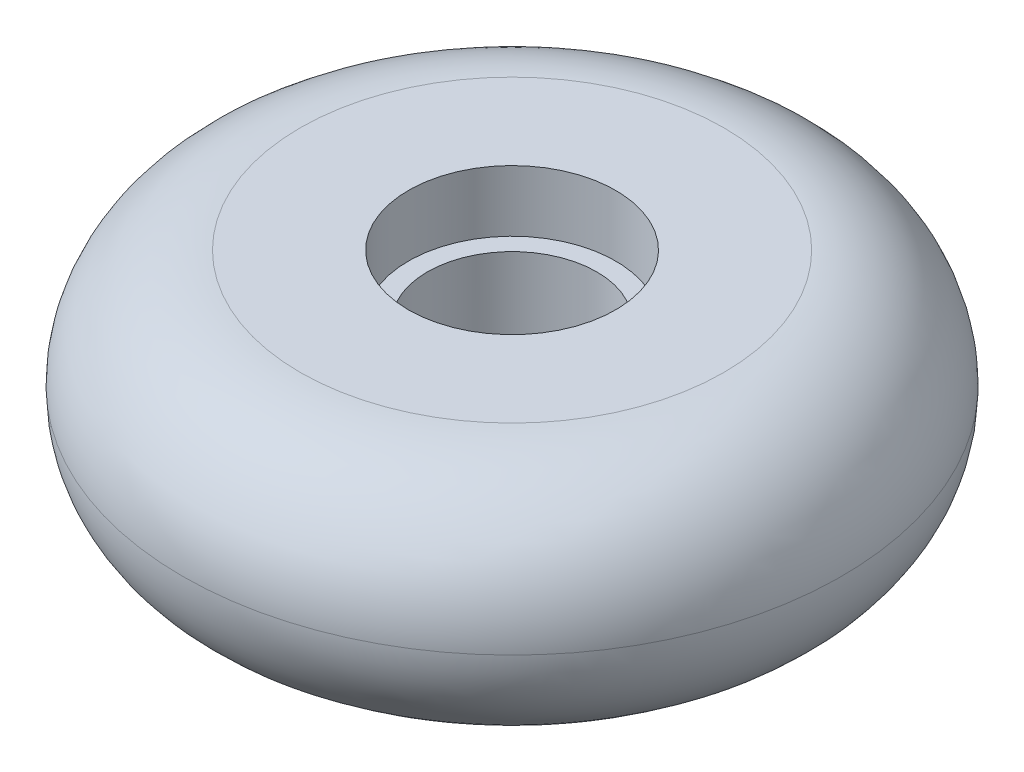
ISO-10303-21;
HEADER;
FILE_DESCRIPTION(('STEP AP214'),'2;1');
FILE_NAME('part.step','',(''),(''),'','','');
FILE_SCHEMA(('AUTOMOTIVE_DESIGN { 1 0 10303 214 1 1 1 1 }'));
ENDSEC;
DATA;
#1=APPLICATION_CONTEXT('core data for automotive mechanical design processes');
#2=APPLICATION_PROTOCOL_DEFINITION('international standard','automotive_design',2000,#1);
#3=PRODUCT_CONTEXT('',#1,'mechanical');
#4=PRODUCT('Part','Part','',(#3));
#5=PRODUCT_RELATED_PRODUCT_CATEGORY('part','',(#4));
#6=PRODUCT_DEFINITION_FORMATION('','',#4);
#7=PRODUCT_DEFINITION_CONTEXT('part definition',#1,'design');
#8=PRODUCT_DEFINITION('design','',#6,#7);
#9=PRODUCT_DEFINITION_SHAPE('','',#8);
#10=(LENGTH_UNIT() NAMED_UNIT(*) SI_UNIT(.MILLI.,.METRE.));
#11=(NAMED_UNIT(*) PLANE_ANGLE_UNIT() SI_UNIT($,.RADIAN.));
#12=(NAMED_UNIT(*) SI_UNIT($,.STERADIAN.) SOLID_ANGLE_UNIT());
#13=UNCERTAINTY_MEASURE_WITH_UNIT(LENGTH_MEASURE(1.E-05),#10,'distance_accuracy_value','');
#14=(GEOMETRIC_REPRESENTATION_CONTEXT(3) GLOBAL_UNCERTAINTY_ASSIGNED_CONTEXT((#13)) GLOBAL_UNIT_ASSIGNED_CONTEXT((#10,
#11,#12)) REPRESENTATION_CONTEXT('',''));
#15=CARTESIAN_POINT('',(0.,0.,0.));
#16=DIRECTION('',(0.,0.,1.));
#17=DIRECTION('',(1.,0.,0.));
#18=AXIS2_PLACEMENT_3D('',#15,#16,#17);
#19=CARTESIAN_POINT('',(0.,25.,0.));
#20=DIRECTION('',(0.,1.,0.));
#21=DIRECTION('',(0.,0.,1.));
#22=AXIS2_PLACEMENT_3D('',#19,#20,#21);
#23=PLANE('',#22);
#24=CARTESIAN_POINT('',(0.,25.,0.));
#25=DIRECTION('',(0.,1.,0.));
#26=DIRECTION('',(0.,0.,1.));
#27=AXIS2_PLACEMENT_3D('',#24,#25,#26);
#28=CIRCLE('',#27,11.);
#29=CARTESIAN_POINT('',(0.,25.,11.));
#30=VERTEX_POINT('',#29);
#31=EDGE_CURVE('E45',#30,#30,#28,.T.);
#32=ORIENTED_EDGE('',*,*,#31,.F.);
#33=EDGE_LOOP('',(#32));
#34=FACE_BOUND('',#33,.T.);
#35=CARTESIAN_POINT('',(0.,25.,0.));
#36=DIRECTION('',(0.,1.,0.));
#37=DIRECTION('',(0.,0.,1.));
#38=AXIS2_PLACEMENT_3D('',#35,#36,#37);
#39=CIRCLE('',#38,22.5);
#40=CARTESIAN_POINT('',(0.,25.,22.5));
#41=VERTEX_POINT('',#40);
#42=EDGE_CURVE('E10',#41,#41,#39,.T.);
#43=ORIENTED_EDGE('',*,*,#42,.T.);
#44=EDGE_LOOP('',(#43));
#45=FACE_BOUND('',#44,.T.);
#46=ADVANCED_FACE('F31',(#34,#45),#23,.T.);
#47=CARTESIAN_POINT('',(0.,0.,0.));
#48=DIRECTION('',(0.,1.,0.));
#49=DIRECTION('',(0.,0.,1.));
#50=AXIS2_PLACEMENT_3D('',#47,#48,#49);
#51=PLANE('',#50);
#52=CARTESIAN_POINT('',(0.,0.,0.));
#53=DIRECTION('',(0.,-1.,0.));
#54=DIRECTION('',(0.,0.,-1.));
#55=AXIS2_PLACEMENT_3D('',#52,#53,#54);
#56=CIRCLE('',#55,11.);
#57=CARTESIAN_POINT('',(0.,0.,-11.));
#58=VERTEX_POINT('',#57);
#59=EDGE_CURVE('E52',#58,#58,#56,.T.);
#60=ORIENTED_EDGE('',*,*,#59,.F.);
#61=EDGE_LOOP('',(#60));
#62=FACE_BOUND('',#61,.T.);
#63=CARTESIAN_POINT('',(0.,0.,0.));
#64=DIRECTION('',(0.,1.,0.));
#65=DIRECTION('',(0.,0.,1.));
#66=AXIS2_PLACEMENT_3D('',#63,#64,#65);
#67=CIRCLE('',#66,22.5);
#68=CARTESIAN_POINT('',(0.,0.,22.5));
#69=VERTEX_POINT('',#68);
#70=EDGE_CURVE('E39',#69,#69,#67,.F.);
#71=ORIENTED_EDGE('',*,*,#70,.T.);
#72=EDGE_LOOP('',(#71));
#73=FACE_BOUND('',#72,.T.);
#74=ADVANCED_FACE('F79',(#62,#73),#51,.F.);
#75=CARTESIAN_POINT('',(0.,12.5,0.));
#76=DIRECTION('',(0.,1.,0.));
#77=DIRECTION('',(0.,0.,1.));
#78=AXIS2_PLACEMENT_3D('',#75,#76,#77);
#79=TOROIDAL_SURFACE('',#78,22.5,12.5);
#80=ORIENTED_EDGE('',*,*,#42,.F.);
#81=EDGE_LOOP('',(#80));
#82=FACE_BOUND('',#81,.T.);
#83=CARTESIAN_POINT('',(0.,12.5,0.));
#84=DIRECTION('',(0.,1.,0.));
#85=DIRECTION('',(0.,0.,1.));
#86=AXIS2_PLACEMENT_3D('',#83,#84,#85);
#87=CIRCLE('',#86,35.);
#88=CARTESIAN_POINT('',(0.,12.5,35.));
#89=VERTEX_POINT('',#88);
#90=EDGE_CURVE('E35',#89,#89,#87,.F.);
#91=ORIENTED_EDGE('',*,*,#90,.F.);
#92=EDGE_LOOP('',(#91));
#93=FACE_BOUND('',#92,.T.);
#94=ADVANCED_FACE('F33',(#82,#93),#79,.T.);
#95=CARTESIAN_POINT('',(0.,12.5,0.));
#96=DIRECTION('',(0.,1.,0.));
#97=DIRECTION('',(0.,0.,1.));
#98=AXIS2_PLACEMENT_3D('',#95,#96,#97);
#99=TOROIDAL_SURFACE('',#98,22.5,12.5);
#100=ORIENTED_EDGE('',*,*,#70,.F.);
#101=EDGE_LOOP('',(#100));
#102=FACE_BOUND('',#101,.T.);
#103=ORIENTED_EDGE('',*,*,#90,.T.);
#104=EDGE_LOOP('',(#103));
#105=FACE_BOUND('',#104,.T.);
#106=ADVANCED_FACE('F85',(#102,#105),#99,.T.);
#107=CARTESIAN_POINT('',(0.,18.5,0.));
#108=DIRECTION('',(0.,1.,0.));
#109=DIRECTION('',(0.,0.,1.));
#110=AXIS2_PLACEMENT_3D('',#107,#108,#109);
#111=CYLINDRICAL_SURFACE('',#110,11.);
#112=CARTESIAN_POINT('',(0.,18.5,0.));
#113=DIRECTION('',(0.,1.,0.));
#114=DIRECTION('',(0.,0.,1.));
#115=AXIS2_PLACEMENT_3D('',#112,#113,#114);
#116=CIRCLE('',#115,11.);
#117=CARTESIAN_POINT('',(0.,18.5,11.));
#118=VERTEX_POINT('',#117);
#119=EDGE_CURVE('E48',#118,#118,#116,.T.);
#120=CARTESIAN_POINT('',(0.,18.5,11.));
#121=CARTESIAN_POINT('',(0.,18.5677083333333,11.));
#122=CARTESIAN_POINT('',(0.,18.6354166666667,11.));
#123=CARTESIAN_POINT('',(0.,18.7708333333333,11.));
#124=CARTESIAN_POINT('',(0.,18.8385416666667,11.));
#125=CARTESIAN_POINT('',(0.,18.9739583333333,11.));
#126=CARTESIAN_POINT('',(0.,19.0416666666667,11.));
#127=CARTESIAN_POINT('',(0.,19.1770833333333,11.));
#128=CARTESIAN_POINT('',(0.,19.2447916666667,11.));
#129=CARTESIAN_POINT('',(0.,19.3802083333333,11.));
#130=CARTESIAN_POINT('',(0.,19.4479166666667,11.));
#131=CARTESIAN_POINT('',(0.,19.5833333333333,11.));
#132=CARTESIAN_POINT('',(0.,19.6510416666667,11.));
#133=CARTESIAN_POINT('',(0.,19.7864583333333,11.));
#134=CARTESIAN_POINT('',(0.,19.8541666666667,11.));
#135=CARTESIAN_POINT('',(0.,19.9895833333333,11.));
#136=CARTESIAN_POINT('',(0.,20.0572916666667,11.));
#137=CARTESIAN_POINT('',(0.,20.1927083333333,11.));
#138=CARTESIAN_POINT('',(0.,20.2604166666667,11.));
#139=CARTESIAN_POINT('',(0.,20.3958333333333,11.));
#140=CARTESIAN_POINT('',(0.,20.4635416666667,11.));
#141=CARTESIAN_POINT('',(0.,20.5989583333333,11.));
#142=CARTESIAN_POINT('',(0.,20.6666666666667,11.));
#143=CARTESIAN_POINT('',(0.,20.8020833333333,11.));
#144=CARTESIAN_POINT('',(0.,20.8697916666667,11.));
#145=CARTESIAN_POINT('',(0.,21.0052083333333,11.));
#146=CARTESIAN_POINT('',(0.,21.0729166666667,11.));
#147=CARTESIAN_POINT('',(0.,21.2083333333333,11.));
#148=CARTESIAN_POINT('',(0.,21.2760416666667,11.));
#149=CARTESIAN_POINT('',(0.,21.4114583333333,11.));
#150=CARTESIAN_POINT('',(0.,21.4791666666667,11.));
#151=CARTESIAN_POINT('',(0.,21.6145833333333,11.));
#152=CARTESIAN_POINT('',(0.,21.6822916666667,11.));
#153=CARTESIAN_POINT('',(0.,21.8177083333333,11.));
#154=CARTESIAN_POINT('',(0.,21.8854166666667,11.));
#155=CARTESIAN_POINT('',(0.,22.0208333333333,11.));
#156=CARTESIAN_POINT('',(0.,22.0885416666667,11.));
#157=CARTESIAN_POINT('',(0.,22.2239583333333,11.));
#158=CARTESIAN_POINT('',(0.,22.2916666666667,11.));
#159=CARTESIAN_POINT('',(0.,22.4270833333333,11.));
#160=CARTESIAN_POINT('',(0.,22.4947916666667,11.));
#161=CARTESIAN_POINT('',(0.,22.6302083333333,11.));
#162=CARTESIAN_POINT('',(0.,22.6979166666667,11.));
#163=CARTESIAN_POINT('',(0.,22.8333333333333,11.));
#164=CARTESIAN_POINT('',(0.,22.9010416666667,11.));
#165=CARTESIAN_POINT('',(0.,23.0364583333333,11.));
#166=CARTESIAN_POINT('',(0.,23.1041666666667,11.));
#167=CARTESIAN_POINT('',(0.,23.2395833333333,11.));
#168=CARTESIAN_POINT('',(0.,23.3072916666667,11.));
#169=CARTESIAN_POINT('',(0.,23.4427083333333,11.));
#170=CARTESIAN_POINT('',(0.,23.5104166666667,11.));
#171=CARTESIAN_POINT('',(0.,23.6458333333333,11.));
#172=CARTESIAN_POINT('',(0.,23.7135416666667,11.));
#173=CARTESIAN_POINT('',(0.,23.8489583333333,11.));
#174=CARTESIAN_POINT('',(0.,23.9166666666667,11.));
#175=CARTESIAN_POINT('',(0.,24.0520833333333,11.));
#176=CARTESIAN_POINT('',(0.,24.1197916666667,11.));
#177=CARTESIAN_POINT('',(0.,24.2552083333333,11.));
#178=CARTESIAN_POINT('',(0.,24.3229166666667,11.));
#179=CARTESIAN_POINT('',(0.,24.4583333333333,11.));
#180=CARTESIAN_POINT('',(0.,24.5260416666667,11.));
#181=CARTESIAN_POINT('',(0.,24.6614583333333,11.));
#182=CARTESIAN_POINT('',(0.,24.7291666666667,11.));
#183=CARTESIAN_POINT('',(0.,24.8645833333333,11.));
#184=CARTESIAN_POINT('',(0.,24.9322916666667,11.));
#185=CARTESIAN_POINT('',(0.,25.,11.));
#186=B_SPLINE_CURVE_WITH_KNOTS('',3,(#120,#121,#122,#123,#124,#125,#126,#127,#128,#129,#130,
#131,#132,#133,#134,#135,#136,#137,#138,#139,#140,#141,#142,#143,#144,#145,#146,#147,#148,#149,
#150,#151,#152,#153,#154,#155,#156,#157,#158,#159,#160,#161,#162,#163,#164,#165,#166,#167,#168,
#169,#170,#171,#172,#173,#174,#175,#176,#177,#178,#179,#180,#181,#182,#183,#184,#185),
.UNSPECIFIED.,.F.,.F.,(4,2,2,2,2,2,2,2,2,2,2,2,2,2,2,2,2,2,2,2,2,2,2,2,2,2,2,2,2,2,2,2,4),(0.,
0.203125000000002,0.40625,0.609375000000002,0.812500000000001,1.015625,1.21875,1.421875,1.625,
1.828125,2.03125,2.234375,2.4375,2.640625,2.84375,3.046875,3.25,3.453125,3.65625,3.859375,
4.0625,4.265625,4.46875,4.671875,4.875,5.078125,5.28125,5.484375,5.6875,5.890625,6.09375,
6.296875,6.5),.UNSPECIFIED.);
#187=EDGE_CURVE('BSEAM88',#118,#30,#186,.T.);
#188=ORIENTED_EDGE('',*,*,#119,.F.);
#189=ORIENTED_EDGE('',*,*,#31,.T.);
#190=ORIENTED_EDGE('',*,*,#187,.T.);
#191=ORIENTED_EDGE('',*,*,#187,.F.);
#192=EDGE_LOOP('',(#188,#190,#189,#191));
#193=FACE_BOUND('',#192,.T.);
#194=ADVANCED_FACE('F88',(#193),#111,.F.);
#195=CARTESIAN_POINT('',(0.,18.5,0.));
#196=DIRECTION('',(0.,1.,0.));
#197=DIRECTION('',(0.,0.,1.));
#198=AXIS2_PLACEMENT_3D('',#195,#196,#197);
#199=PLANE('',#198);
#200=CARTESIAN_POINT('',(0.,18.5,0.));
#201=DIRECTION('',(0.,1.,0.));
#202=DIRECTION('',(0.,0.,1.));
#203=AXIS2_PLACEMENT_3D('',#200,#201,#202);
#204=CIRCLE('',#203,9.);
#205=CARTESIAN_POINT('',(0.,18.5,9.));
#206=VERTEX_POINT('',#205);
#207=EDGE_CURVE('E55',#206,#206,#204,.T.);
#208=ORIENTED_EDGE('',*,*,#207,.F.);
#209=EDGE_LOOP('',(#208));
#210=FACE_BOUND('',#209,.T.);
#211=ORIENTED_EDGE('',*,*,#119,.T.);
#212=EDGE_LOOP('',(#211));
#213=FACE_BOUND('',#212,.T.);
#214=ADVANCED_FACE('F75',(#210,#213),#199,.T.);
#215=CARTESIAN_POINT('',(0.,6.5,0.));
#216=DIRECTION('',(0.,-1.,0.));
#217=DIRECTION('',(0.,0.,-1.));
#218=AXIS2_PLACEMENT_3D('',#215,#216,#217);
#219=CYLINDRICAL_SURFACE('',#218,11.);
#220=CARTESIAN_POINT('',(0.,6.5,0.));
#221=DIRECTION('',(0.,-1.,0.));
#222=DIRECTION('',(0.,0.,-1.));
#223=AXIS2_PLACEMENT_3D('',#220,#221,#222);
#224=CIRCLE('',#223,11.);
#225=CARTESIAN_POINT('',(0.,6.5,-11.));
#226=VERTEX_POINT('',#225);
#227=EDGE_CURVE('E49',#226,#226,#224,.T.);
#228=CARTESIAN_POINT('',(0.,6.5,-11.));
#229=CARTESIAN_POINT('',(0.,6.43229166666667,-11.));
#230=CARTESIAN_POINT('',(0.,6.36458333333333,-11.));
#231=CARTESIAN_POINT('',(0.,6.22916666666667,-11.));
#232=CARTESIAN_POINT('',(0.,6.16145833333333,-11.));
#233=CARTESIAN_POINT('',(0.,6.02604166666667,-11.));
#234=CARTESIAN_POINT('',(0.,5.95833333333333,-11.));
#235=CARTESIAN_POINT('',(0.,5.82291666666667,-11.));
#236=CARTESIAN_POINT('',(0.,5.75520833333333,-11.));
#237=CARTESIAN_POINT('',(0.,5.61979166666667,-11.));
#238=CARTESIAN_POINT('',(0.,5.55208333333333,-11.));
#239=CARTESIAN_POINT('',(0.,5.41666666666667,-11.));
#240=CARTESIAN_POINT('',(0.,5.34895833333333,-11.));
#241=CARTESIAN_POINT('',(0.,5.21354166666667,-11.));
#242=CARTESIAN_POINT('',(0.,5.14583333333333,-11.));
#243=CARTESIAN_POINT('',(0.,5.01041666666667,-11.));
#244=CARTESIAN_POINT('',(0.,4.94270833333333,-11.));
#245=CARTESIAN_POINT('',(0.,4.80729166666667,-11.));
#246=CARTESIAN_POINT('',(0.,4.73958333333333,-11.));
#247=CARTESIAN_POINT('',(0.,4.60416666666667,-11.));
#248=CARTESIAN_POINT('',(0.,4.53645833333333,-11.));
#249=CARTESIAN_POINT('',(0.,4.40104166666667,-11.));
#250=CARTESIAN_POINT('',(0.,4.33333333333333,-11.));
#251=CARTESIAN_POINT('',(0.,4.19791666666667,-11.));
#252=CARTESIAN_POINT('',(0.,4.13020833333333,-11.));
#253=CARTESIAN_POINT('',(0.,3.99479166666667,-11.));
#254=CARTESIAN_POINT('',(0.,3.92708333333333,-11.));
#255=CARTESIAN_POINT('',(0.,3.79166666666667,-11.));
#256=CARTESIAN_POINT('',(0.,3.72395833333333,-11.));
#257=CARTESIAN_POINT('',(0.,3.58854166666667,-11.));
#258=CARTESIAN_POINT('',(0.,3.52083333333333,-11.));
#259=CARTESIAN_POINT('',(0.,3.38541666666667,-11.));
#260=CARTESIAN_POINT('',(0.,3.31770833333333,-11.));
#261=CARTESIAN_POINT('',(0.,3.18229166666667,-11.));
#262=CARTESIAN_POINT('',(0.,3.11458333333333,-11.));
#263=CARTESIAN_POINT('',(0.,2.97916666666667,-11.));
#264=CARTESIAN_POINT('',(0.,2.91145833333333,-11.));
#265=CARTESIAN_POINT('',(0.,2.77604166666667,-11.));
#266=CARTESIAN_POINT('',(0.,2.70833333333333,-11.));
#267=CARTESIAN_POINT('',(0.,2.57291666666667,-11.));
#268=CARTESIAN_POINT('',(0.,2.50520833333333,-11.));
#269=CARTESIAN_POINT('',(0.,2.36979166666667,-11.));
#270=CARTESIAN_POINT('',(0.,2.30208333333333,-11.));
#271=CARTESIAN_POINT('',(0.,2.16666666666667,-11.));
#272=CARTESIAN_POINT('',(0.,2.09895833333333,-11.));
#273=CARTESIAN_POINT('',(0.,1.96354166666667,-11.));
#274=CARTESIAN_POINT('',(0.,1.89583333333333,-11.));
#275=CARTESIAN_POINT('',(0.,1.76041666666667,-11.));
#276=CARTESIAN_POINT('',(0.,1.69270833333333,-11.));
#277=CARTESIAN_POINT('',(0.,1.55729166666667,-11.));
#278=CARTESIAN_POINT('',(0.,1.48958333333333,-11.));
#279=CARTESIAN_POINT('',(0.,1.35416666666667,-11.));
#280=CARTESIAN_POINT('',(0.,1.28645833333333,-11.));
#281=CARTESIAN_POINT('',(0.,1.15104166666667,-11.));
#282=CARTESIAN_POINT('',(0.,1.08333333333333,-11.));
#283=CARTESIAN_POINT('',(0.,0.947916666666667,-11.));
#284=CARTESIAN_POINT('',(0.,0.880208333333333,-11.));
#285=CARTESIAN_POINT('',(0.,0.744791666666667,-11.));
#286=CARTESIAN_POINT('',(0.,0.677083333333334,-11.));
#287=CARTESIAN_POINT('',(0.,0.541666666666667,-11.));
#288=CARTESIAN_POINT('',(0.,0.473958333333334,-11.));
#289=CARTESIAN_POINT('',(0.,0.338541666666667,-11.));
#290=CARTESIAN_POINT('',(0.,0.270833333333334,-11.));
#291=CARTESIAN_POINT('',(0.,0.135416666666667,-11.));
#292=CARTESIAN_POINT('',(0.,0.0677083333333333,-11.));
#293=CARTESIAN_POINT('',(0.,0.,-11.));
#294=B_SPLINE_CURVE_WITH_KNOTS('',3,(#228,#229,#230,#231,#232,#233,#234,#235,#236,#237,#238,
#239,#240,#241,#242,#243,#244,#245,#246,#247,#248,#249,#250,#251,#252,#253,#254,#255,#256,#257,
#258,#259,#260,#261,#262,#263,#264,#265,#266,#267,#268,#269,#270,#271,#272,#273,#274,#275,#276,
#277,#278,#279,#280,#281,#282,#283,#284,#285,#286,#287,#288,#289,#290,#291,#292,#293),
.UNSPECIFIED.,.F.,.F.,(4,2,2,2,2,2,2,2,2,2,2,2,2,2,2,2,2,2,2,2,2,2,2,2,2,2,2,2,2,2,2,2,4),(0.,
0.203125,0.40625,0.609375000000001,0.812500000000001,1.015625,1.21875,1.421875,1.625,1.828125,
2.03125,2.234375,2.4375,2.640625,2.84375,3.046875,3.25,3.453125,3.65625,3.859375,4.0625,
4.265625,4.46875,4.671875,4.875,5.078125,5.28125,5.484375,5.6875,5.890625,6.09375,6.296875,6.5),.UNSPECIFIED.);
#295=EDGE_CURVE('BSEAM69',#226,#58,#294,.T.);
#296=ORIENTED_EDGE('',*,*,#227,.F.);
#297=ORIENTED_EDGE('',*,*,#59,.T.);
#298=ORIENTED_EDGE('',*,*,#295,.T.);
#299=ORIENTED_EDGE('',*,*,#295,.F.);
#300=EDGE_LOOP('',(#296,#298,#297,#299));
#301=FACE_BOUND('',#300,.T.);
#302=ADVANCED_FACE('F69',(#301),#219,.F.);
#303=CARTESIAN_POINT('',(0.,6.5,0.));
#304=DIRECTION('',(0.,-1.,0.));
#305=DIRECTION('',(0.,0.,-1.));
#306=AXIS2_PLACEMENT_3D('',#303,#304,#305);
#307=PLANE('',#306);
#308=CARTESIAN_POINT('',(0.,6.5,0.));
#309=DIRECTION('',(0.,-1.,0.));
#310=DIRECTION('',(0.,0.,-1.));
#311=AXIS2_PLACEMENT_3D('',#308,#309,#310);
#312=CIRCLE('',#311,9.);
#313=CARTESIAN_POINT('',(0.,6.5,-9.));
#314=VERTEX_POINT('',#313);
#315=EDGE_CURVE('E60',#314,#314,#312,.T.);
#316=ORIENTED_EDGE('',*,*,#315,.F.);
#317=EDGE_LOOP('',(#316));
#318=FACE_BOUND('',#317,.T.);
#319=ORIENTED_EDGE('',*,*,#227,.T.);
#320=EDGE_LOOP('',(#319));
#321=FACE_BOUND('',#320,.T.);
#322=ADVANCED_FACE('F66',(#318,#321),#307,.T.);
#323=CARTESIAN_POINT('',(0.,25.,0.));
#324=DIRECTION('',(0.,-1.,0.));
#325=DIRECTION('',(0.,0.,-1.));
#326=AXIS2_PLACEMENT_3D('',#323,#324,#325);
#327=CYLINDRICAL_SURFACE('',#326,9.);
#328=ORIENTED_EDGE('',*,*,#207,.T.);
#329=EDGE_LOOP('',(#328));
#330=FACE_BOUND('',#329,.T.);
#331=ORIENTED_EDGE('',*,*,#315,.T.);
#332=EDGE_LOOP('',(#331));
#333=FACE_BOUND('',#332,.T.);
#334=ADVANCED_FACE('F64',(#330,#333),#327,.F.);
#335=CLOSED_SHELL('',(#46,#74,#94,#106,#194,#214,#302,#322,#334));
#336=MANIFOLD_SOLID_BREP('B2',#335);
#337=ADVANCED_BREP_SHAPE_REPRESENTATION('',(#18,#336),#14);
#338=SHAPE_DEFINITION_REPRESENTATION(#9,#337);
ENDSEC;
END-ISO-10303-21;
